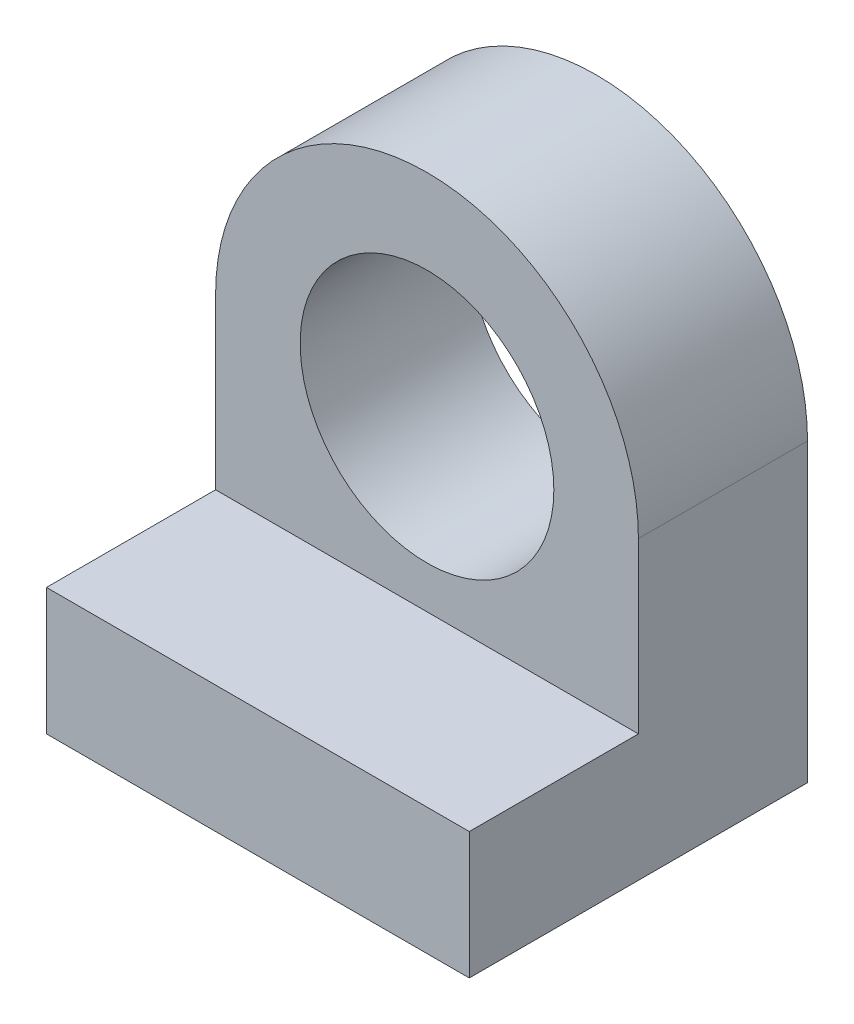
ISO-10303-21;
HEADER;
FILE_DESCRIPTION(('STEP AP214'),'2;1');
FILE_NAME('part.step','',(''),(''),'','','');
FILE_SCHEMA(('AUTOMOTIVE_DESIGN { 1 0 10303 214 1 1 1 1 }'));
ENDSEC;
DATA;
#1=APPLICATION_CONTEXT('core data for automotive mechanical design processes');
#2=APPLICATION_PROTOCOL_DEFINITION('international standard','automotive_design',2000,#1);
#3=PRODUCT_CONTEXT('',#1,'mechanical');
#4=PRODUCT('Part','Part','',(#3));
#5=PRODUCT_RELATED_PRODUCT_CATEGORY('part','',(#4));
#6=PRODUCT_DEFINITION_FORMATION('','',#4);
#7=PRODUCT_DEFINITION_CONTEXT('part definition',#1,'design');
#8=PRODUCT_DEFINITION('design','',#6,#7);
#9=PRODUCT_DEFINITION_SHAPE('','',#8);
#10=(LENGTH_UNIT() NAMED_UNIT(*) SI_UNIT(.MILLI.,.METRE.));
#11=(NAMED_UNIT(*) PLANE_ANGLE_UNIT() SI_UNIT($,.RADIAN.));
#12=(NAMED_UNIT(*) SI_UNIT($,.STERADIAN.) SOLID_ANGLE_UNIT());
#13=UNCERTAINTY_MEASURE_WITH_UNIT(LENGTH_MEASURE(1.E-05),#10,'distance_accuracy_value','');
#14=(GEOMETRIC_REPRESENTATION_CONTEXT(3) GLOBAL_UNCERTAINTY_ASSIGNED_CONTEXT((#13)) GLOBAL_UNIT_ASSIGNED_CONTEXT((#10,
#11,#12)) REPRESENTATION_CONTEXT('',''));
#15=CARTESIAN_POINT('',(0.,0.,0.));
#16=DIRECTION('',(0.,0.,1.));
#17=DIRECTION('',(1.,0.,0.));
#18=AXIS2_PLACEMENT_3D('',#15,#16,#17);
#19=CARTESIAN_POINT('',(-12.5,7.5,-20.));
#20=DIRECTION('',(0.,1.,0.));
#21=DIRECTION('',(-1.,0.,0.));
#22=AXIS2_PLACEMENT_3D('',#19,#20,#21);
#23=PLANE('',#22);
#24=DIRECTION('',(1.,0.,0.));
#25=VECTOR('',#24,1.);
#26=CARTESIAN_POINT('',(-12.5,7.5,-10.));
#27=LINE('',#26,#25);
#28=CARTESIAN_POINT('',(-12.5,7.5,-10.));
#29=VERTEX_POINT('',#28);
#30=CARTESIAN_POINT('',(12.5,7.5,-10.));
#31=VERTEX_POINT('',#30);
#32=EDGE_CURVE('E49',#29,#31,#27,.T.);
#33=ORIENTED_EDGE('',*,*,#32,.F.);
#34=DIRECTION('',(0.,0.,1.));
#35=VECTOR('',#34,1.);
#36=CARTESIAN_POINT('',(-12.5,7.5,-20.));
#37=LINE('',#36,#35);
#38=CARTESIAN_POINT('',(-12.5,7.5,0.));
#39=VERTEX_POINT('',#38);
#40=EDGE_CURVE('E36',#29,#39,#37,.T.);
#41=ORIENTED_EDGE('',*,*,#40,.T.);
#42=DIRECTION('',(-1.,0.,0.));
#43=VECTOR('',#42,1.);
#44=CARTESIAN_POINT('',(-12.5,7.5,0.));
#45=LINE('',#44,#43);
#46=CARTESIAN_POINT('',(12.5,7.5,0.));
#47=VERTEX_POINT('',#46);
#48=EDGE_CURVE('E81',#47,#39,#45,.T.);
#49=ORIENTED_EDGE('',*,*,#48,.F.);
#50=DIRECTION('',(0.,0.,1.));
#51=VECTOR('',#50,1.);
#52=CARTESIAN_POINT('',(12.5,7.5,-20.));
#53=LINE('',#52,#51);
#54=EDGE_CURVE('E11',#31,#47,#53,.T.);
#55=ORIENTED_EDGE('',*,*,#54,.F.);
#56=EDGE_LOOP('',(#33,#41,#49,#55));
#57=FACE_BOUND('',#56,.T.);
#58=ADVANCED_FACE('F33',(#57),#23,.T.);
#59=CARTESIAN_POINT('',(12.5,7.5,-20.));
#60=DIRECTION('',(1.,0.,0.));
#61=DIRECTION('',(0.,1.,0.));
#62=AXIS2_PLACEMENT_3D('',#59,#60,#61);
#63=PLANE('',#62);
#64=DIRECTION('',(0.,1.,0.));
#65=VECTOR('',#64,1.);
#66=CARTESIAN_POINT('',(12.5,7.5,0.));
#67=LINE('',#66,#65);
#68=CARTESIAN_POINT('',(12.5,0.,0.));
#69=VERTEX_POINT('',#68);
#70=EDGE_CURVE('E75',#69,#47,#67,.T.);
#71=ORIENTED_EDGE('',*,*,#70,.F.);
#72=DIRECTION('',(0.,0.,1.));
#73=VECTOR('',#72,1.);
#74=CARTESIAN_POINT('',(12.5,0.,-20.));
#75=LINE('',#74,#73);
#76=CARTESIAN_POINT('',(12.5,0.,-20.));
#77=VERTEX_POINT('',#76);
#78=EDGE_CURVE('E41',#77,#69,#75,.T.);
#79=ORIENTED_EDGE('',*,*,#78,.F.);
#80=DIRECTION('',(0.,1.,0.));
#81=VECTOR('',#80,1.);
#82=CARTESIAN_POINT('',(12.5,7.5,-20.));
#83=LINE('',#82,#81);
#84=CARTESIAN_POINT('',(12.5,17.5,-20.));
#85=VERTEX_POINT('',#84);
#86=EDGE_CURVE('E102',#77,#85,#83,.T.);
#87=ORIENTED_EDGE('',*,*,#86,.T.);
#88=DIRECTION('',(0.,0.,1.));
#89=VECTOR('',#88,1.);
#90=CARTESIAN_POINT('',(12.5,17.5,-20.));
#91=LINE('',#90,#89);
#92=CARTESIAN_POINT('',(12.5,17.5,-10.));
#93=VERTEX_POINT('',#92);
#94=EDGE_CURVE('E86',#85,#93,#91,.T.);
#95=ORIENTED_EDGE('',*,*,#94,.T.);
#96=DIRECTION('',(0.,1.,0.));
#97=VECTOR('',#96,1.);
#98=CARTESIAN_POINT('',(12.5,17.5,-10.));
#99=LINE('',#98,#97);
#100=EDGE_CURVE('E79',#31,#93,#99,.T.);
#101=ORIENTED_EDGE('',*,*,#100,.F.);
#102=ORIENTED_EDGE('',*,*,#54,.T.);
#103=EDGE_LOOP('',(#71,#79,#87,#95,#101,#102));
#104=FACE_BOUND('',#103,.T.);
#105=ADVANCED_FACE('F73',(#104),#63,.T.);
#106=CARTESIAN_POINT('',(-12.5,0.,-20.));
#107=DIRECTION('',(0.,-1.,0.));
#108=DIRECTION('',(0.,0.,-1.));
#109=AXIS2_PLACEMENT_3D('',#106,#107,#108);
#110=PLANE('',#109);
#111=DIRECTION('',(1.,0.,0.));
#112=VECTOR('',#111,1.);
#113=CARTESIAN_POINT('',(-12.5,0.,0.));
#114=LINE('',#113,#112);
#115=CARTESIAN_POINT('',(-12.5,0.,0.));
#116=VERTEX_POINT('',#115);
#117=EDGE_CURVE('E91',#116,#69,#114,.T.);
#118=ORIENTED_EDGE('',*,*,#117,.F.);
#119=DIRECTION('',(0.,0.,1.));
#120=VECTOR('',#119,1.);
#121=CARTESIAN_POINT('',(-12.5,0.,-20.));
#122=LINE('',#121,#120);
#123=CARTESIAN_POINT('',(-12.5,0.,-20.));
#124=VERTEX_POINT('',#123);
#125=EDGE_CURVE('E100',#124,#116,#122,.T.);
#126=ORIENTED_EDGE('',*,*,#125,.F.);
#127=DIRECTION('',(1.,0.,0.));
#128=VECTOR('',#127,1.);
#129=CARTESIAN_POINT('',(-12.5,0.,-20.));
#130=LINE('',#129,#128);
#131=EDGE_CURVE('E95',#124,#77,#130,.T.);
#132=ORIENTED_EDGE('',*,*,#131,.T.);
#133=ORIENTED_EDGE('',*,*,#78,.T.);
#134=EDGE_LOOP('',(#118,#126,#132,#133));
#135=FACE_BOUND('',#134,.T.);
#136=ADVANCED_FACE('F159',(#135),#110,.T.);
#137=CARTESIAN_POINT('',(-12.5,0.,-20.));
#138=DIRECTION('',(-1.,0.,0.));
#139=DIRECTION('',(0.,0.,1.));
#140=AXIS2_PLACEMENT_3D('',#137,#138,#139);
#141=PLANE('',#140);
#142=DIRECTION('',(0.,-1.,0.));
#143=VECTOR('',#142,1.);
#144=CARTESIAN_POINT('',(-12.5,0.,0.));
#145=LINE('',#144,#143);
#146=EDGE_CURVE('E85',#39,#116,#145,.T.);
#147=ORIENTED_EDGE('',*,*,#146,.F.);
#148=ORIENTED_EDGE('',*,*,#40,.F.);
#149=DIRECTION('',(0.,-1.,0.));
#150=VECTOR('',#149,1.);
#151=CARTESIAN_POINT('',(-12.5,17.5,-10.));
#152=LINE('',#151,#150);
#153=CARTESIAN_POINT('',(-12.5,17.5,-10.));
#154=VERTEX_POINT('',#153);
#155=EDGE_CURVE('E112',#154,#29,#152,.T.);
#156=ORIENTED_EDGE('',*,*,#155,.F.);
#157=DIRECTION('',(0.,0.,1.));
#158=VECTOR('',#157,1.);
#159=CARTESIAN_POINT('',(-12.5,17.5,-20.));
#160=LINE('',#159,#158);
#161=CARTESIAN_POINT('',(-12.5,17.5,-20.));
#162=VERTEX_POINT('',#161);
#163=EDGE_CURVE('E127',#162,#154,#160,.T.);
#164=ORIENTED_EDGE('',*,*,#163,.F.);
#165=DIRECTION('',(0.,-1.,0.));
#166=VECTOR('',#165,1.);
#167=CARTESIAN_POINT('',(-12.5,0.,-20.));
#168=LINE('',#167,#166);
#169=EDGE_CURVE('E92',#162,#124,#168,.T.);
#170=ORIENTED_EDGE('',*,*,#169,.T.);
#171=ORIENTED_EDGE('',*,*,#125,.T.);
#172=EDGE_LOOP('',(#147,#148,#156,#164,#170,#171));
#173=FACE_BOUND('',#172,.T.);
#174=ADVANCED_FACE('F107',(#173),#141,.T.);
#175=CARTESIAN_POINT('',(0.,0.,-20.));
#176=DIRECTION('',(0.,0.,-1.));
#177=DIRECTION('',(-1.,0.,0.));
#178=AXIS2_PLACEMENT_3D('',#175,#176,#177);
#179=PLANE('',#178);
#180=ORIENTED_EDGE('',*,*,#169,.F.);
#181=CARTESIAN_POINT('',(0.,17.5,-20.));
#182=DIRECTION('',(0.,0.,1.));
#183=DIRECTION('',(1.,0.,0.));
#184=AXIS2_PLACEMENT_3D('',#181,#182,#183);
#185=CIRCLE('',#184,12.5);
#186=EDGE_CURVE('E125',#85,#162,#185,.T.);
#187=ORIENTED_EDGE('',*,*,#186,.F.);
#188=ORIENTED_EDGE('',*,*,#86,.F.);
#189=ORIENTED_EDGE('',*,*,#131,.F.);
#190=EDGE_LOOP('',(#180,#187,#188,#189));
#191=FACE_BOUND('',#190,.T.);
#192=CARTESIAN_POINT('',(0.,17.5,-20.));
#193=DIRECTION('',(0.,0.,1.));
#194=DIRECTION('',(1.,0.,0.));
#195=AXIS2_PLACEMENT_3D('',#192,#193,#194);
#196=CIRCLE('',#195,7.5);
#197=CARTESIAN_POINT('',(7.5,17.5,-20.));
#198=VERTEX_POINT('',#197);
#199=EDGE_CURVE('E120',#198,#198,#196,.T.);
#200=ORIENTED_EDGE('',*,*,#199,.T.);
#201=EDGE_LOOP('',(#200));
#202=FACE_BOUND('',#201,.T.);
#203=ADVANCED_FACE('F140',(#191,#202),#179,.T.);
#204=CARTESIAN_POINT('',(0.,0.,0.));
#205=DIRECTION('',(0.,0.,-1.));
#206=DIRECTION('',(-1.,0.,0.));
#207=AXIS2_PLACEMENT_3D('',#204,#205,#206);
#208=PLANE('',#207);
#209=ORIENTED_EDGE('',*,*,#48,.T.);
#210=ORIENTED_EDGE('',*,*,#146,.T.);
#211=ORIENTED_EDGE('',*,*,#117,.T.);
#212=ORIENTED_EDGE('',*,*,#70,.T.);
#213=EDGE_LOOP('',(#209,#210,#211,#212));
#214=FACE_BOUND('',#213,.T.);
#215=ADVANCED_FACE('F89',(#214),#208,.F.);
#216=CARTESIAN_POINT('',(0.,17.5,-20.));
#217=DIRECTION('',(0.,0.,1.));
#218=DIRECTION('',(1.,0.,0.));
#219=AXIS2_PLACEMENT_3D('',#216,#217,#218);
#220=CYLINDRICAL_SURFACE('',#219,12.5);
#221=CARTESIAN_POINT('',(0.,17.5,-10.));
#222=DIRECTION('',(0.,0.,1.));
#223=DIRECTION('',(1.,0.,0.));
#224=AXIS2_PLACEMENT_3D('',#221,#222,#223);
#225=CIRCLE('',#224,12.5);
#226=EDGE_CURVE('E117',#93,#154,#225,.T.);
#227=ORIENTED_EDGE('',*,*,#226,.F.);
#228=ORIENTED_EDGE('',*,*,#94,.F.);
#229=ORIENTED_EDGE('',*,*,#186,.T.);
#230=ORIENTED_EDGE('',*,*,#163,.T.);
#231=EDGE_LOOP('',(#227,#228,#229,#230));
#232=FACE_BOUND('',#231,.T.);
#233=ADVANCED_FACE('F149',(#232),#220,.T.);
#234=CARTESIAN_POINT('',(0.,17.5,-10.));
#235=DIRECTION('',(0.,0.,1.));
#236=DIRECTION('',(1.,0.,0.));
#237=AXIS2_PLACEMENT_3D('',#234,#235,#236);
#238=PLANE('',#237);
#239=CARTESIAN_POINT('',(0.,17.5,-10.));
#240=DIRECTION('',(0.,0.,1.));
#241=DIRECTION('',(1.,0.,0.));
#242=AXIS2_PLACEMENT_3D('',#239,#240,#241);
#243=CIRCLE('',#242,7.5);
#244=CARTESIAN_POINT('',(7.5,17.5,-10.));
#245=VERTEX_POINT('',#244);
#246=EDGE_CURVE('E134',#245,#245,#243,.T.);
#247=ORIENTED_EDGE('',*,*,#246,.F.);
#248=EDGE_LOOP('',(#247));
#249=FACE_BOUND('',#248,.T.);
#250=ORIENTED_EDGE('',*,*,#226,.T.);
#251=ORIENTED_EDGE('',*,*,#155,.T.);
#252=ORIENTED_EDGE('',*,*,#32,.T.);
#253=ORIENTED_EDGE('',*,*,#100,.T.);
#254=EDGE_LOOP('',(#250,#251,#252,#253));
#255=FACE_BOUND('',#254,.T.);
#256=ADVANCED_FACE('F115',(#249,#255),#238,.T.);
#257=CARTESIAN_POINT('',(0.,17.5,-20.));
#258=DIRECTION('',(0.,0.,1.));
#259=DIRECTION('',(1.,0.,0.));
#260=AXIS2_PLACEMENT_3D('',#257,#258,#259);
#261=CYLINDRICAL_SURFACE('',#260,7.5);
#262=ORIENTED_EDGE('',*,*,#199,.F.);
#263=EDGE_LOOP('',(#262));
#264=FACE_BOUND('',#263,.T.);
#265=ORIENTED_EDGE('',*,*,#246,.T.);
#266=EDGE_LOOP('',(#265));
#267=FACE_BOUND('',#266,.T.);
#268=ADVANCED_FACE('F142',(#264,#267),#261,.F.);
#269=CLOSED_SHELL('',(#58,#105,#136,#174,#203,#215,#233,#256,#268));
#270=MANIFOLD_SOLID_BREP('B2',#269);
#271=ADVANCED_BREP_SHAPE_REPRESENTATION('',(#18,#270),#14);
#272=SHAPE_DEFINITION_REPRESENTATION(#9,#271);
ENDSEC;
END-ISO-10303-21;
